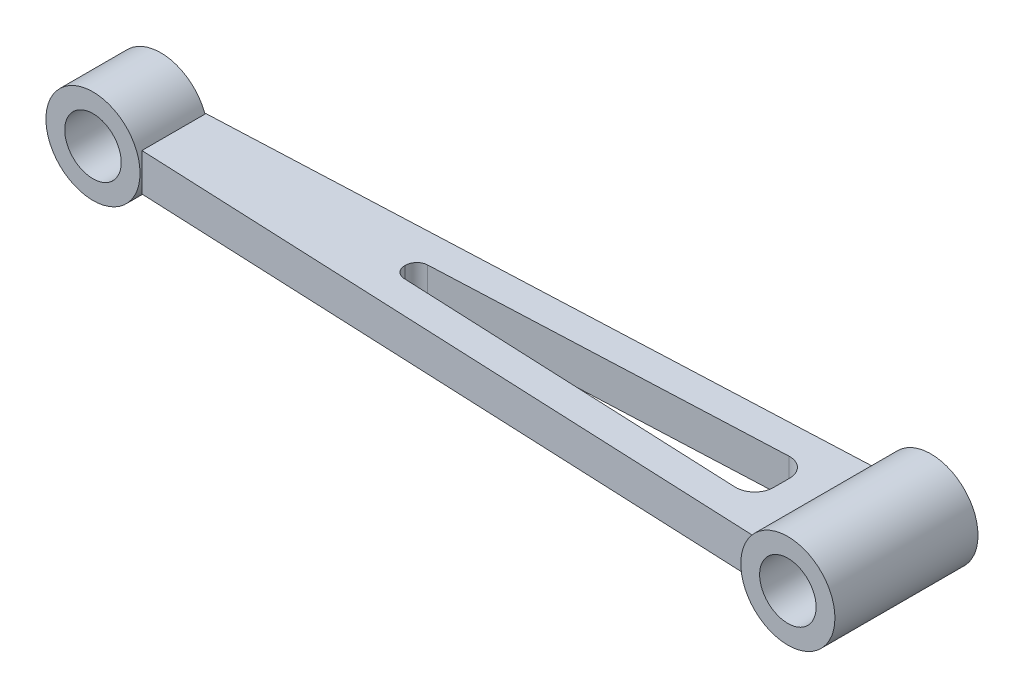
ISO-10303-21;
HEADER;
FILE_DESCRIPTION(('STEP AP214'),'2;1');
FILE_NAME('part.step','',(''),(''),'','','');
FILE_SCHEMA(('AUTOMOTIVE_DESIGN { 1 0 10303 214 1 1 1 1 }'));
ENDSEC;
DATA;
#1=APPLICATION_CONTEXT('core data for automotive mechanical design processes');
#2=APPLICATION_PROTOCOL_DEFINITION('international standard','automotive_design',2000,#1);
#3=PRODUCT_CONTEXT('',#1,'mechanical');
#4=PRODUCT('Part','Part','',(#3));
#5=PRODUCT_RELATED_PRODUCT_CATEGORY('part','',(#4));
#6=PRODUCT_DEFINITION_FORMATION('','',#4);
#7=PRODUCT_DEFINITION_CONTEXT('part definition',#1,'design');
#8=PRODUCT_DEFINITION('design','',#6,#7);
#9=PRODUCT_DEFINITION_SHAPE('','',#8);
#10=(LENGTH_UNIT() NAMED_UNIT(*) SI_UNIT(.MILLI.,.METRE.));
#11=(NAMED_UNIT(*) PLANE_ANGLE_UNIT() SI_UNIT($,.RADIAN.));
#12=(NAMED_UNIT(*) SI_UNIT($,.STERADIAN.) SOLID_ANGLE_UNIT());
#13=UNCERTAINTY_MEASURE_WITH_UNIT(LENGTH_MEASURE(1.E-05),#10,'distance_accuracy_value','');
#14=(GEOMETRIC_REPRESENTATION_CONTEXT(3) GLOBAL_UNCERTAINTY_ASSIGNED_CONTEXT((#13)) GLOBAL_UNIT_ASSIGNED_CONTEXT((#10,
#11,#12)) REPRESENTATION_CONTEXT('',''));
#15=CARTESIAN_POINT('',(0.,0.,0.));
#16=DIRECTION('',(0.,0.,1.));
#17=DIRECTION('',(1.,0.,0.));
#18=AXIS2_PLACEMENT_3D('',#15,#16,#17);
#19=CARTESIAN_POINT('',(182.06,-5.,19.));
#20=DIRECTION('',(0.,0.,1.));
#21=DIRECTION('',(1.,0.,0.));
#22=AXIS2_PLACEMENT_3D('',#19,#20,#21);
#23=PLANE('',#22);
#24=CARTESIAN_POINT('',(182.06,-5.,19.));
#25=DIRECTION('',(0.,0.,1.));
#26=DIRECTION('',(1.,0.,0.));
#27=AXIS2_PLACEMENT_3D('',#24,#25,#26);
#28=CIRCLE('',#27,12.5);
#29=CARTESIAN_POINT('',(194.56,-5.,19.));
#30=VERTEX_POINT('',#29);
#31=EDGE_CURVE('E11',#30,#30,#28,.T.);
#32=ORIENTED_EDGE('',*,*,#31,.T.);
#33=EDGE_LOOP('',(#32));
#34=FACE_BOUND('',#33,.T.);
#35=CARTESIAN_POINT('',(182.06,-5.,19.));
#36=DIRECTION('',(0.,0.,1.));
#37=DIRECTION('',(1.,0.,0.));
#38=AXIS2_PLACEMENT_3D('',#35,#36,#37);
#39=CIRCLE('',#38,7.50000000000001);
#40=CARTESIAN_POINT('',(189.56,-5.,19.));
#41=VERTEX_POINT('',#40);
#42=EDGE_CURVE('E65',#41,#41,#39,.T.);
#43=ORIENTED_EDGE('',*,*,#42,.F.);
#44=EDGE_LOOP('',(#43));
#45=FACE_BOUND('',#44,.T.);
#46=ADVANCED_FACE('F54',(#34,#45),#23,.T.);
#47=CARTESIAN_POINT('',(182.06,-5.,-19.));
#48=DIRECTION('',(0.,0.,1.));
#49=DIRECTION('',(1.,0.,0.));
#50=AXIS2_PLACEMENT_3D('',#47,#48,#49);
#51=PLANE('',#50);
#52=CARTESIAN_POINT('',(182.06,-5.,-19.));
#53=DIRECTION('',(0.,0.,1.));
#54=DIRECTION('',(1.,0.,0.));
#55=AXIS2_PLACEMENT_3D('',#52,#53,#54);
#56=CIRCLE('',#55,12.5);
#57=CARTESIAN_POINT('',(194.56,-5.,-19.));
#58=VERTEX_POINT('',#57);
#59=EDGE_CURVE('E58',#58,#58,#56,.T.);
#60=ORIENTED_EDGE('',*,*,#59,.F.);
#61=EDGE_LOOP('',(#60));
#62=FACE_BOUND('',#61,.T.);
#63=CARTESIAN_POINT('',(182.06,-5.,-19.));
#64=DIRECTION('',(0.,0.,1.));
#65=DIRECTION('',(1.,0.,0.));
#66=AXIS2_PLACEMENT_3D('',#63,#64,#65);
#67=CIRCLE('',#66,7.50000000000001);
#68=CARTESIAN_POINT('',(189.56,-5.,-19.));
#69=VERTEX_POINT('',#68);
#70=EDGE_CURVE('E67',#69,#69,#67,.T.);
#71=ORIENTED_EDGE('',*,*,#70,.T.);
#72=EDGE_LOOP('',(#71));
#73=FACE_BOUND('',#72,.T.);
#74=ADVANCED_FACE('F77',(#62,#73),#51,.F.);
#75=CARTESIAN_POINT('',(182.06,-5.,19.));
#76=DIRECTION('',(0.,0.,-1.));
#77=DIRECTION('',(-1.,0.,0.));
#78=AXIS2_PLACEMENT_3D('',#75,#76,#77);
#79=CYLINDRICAL_SURFACE('',#78,12.5);
#80=ORIENTED_EDGE('',*,*,#31,.F.);
#81=EDGE_LOOP('',(#80));
#82=FACE_BOUND('',#81,.T.);
#83=ORIENTED_EDGE('',*,*,#59,.T.);
#84=EDGE_LOOP('',(#83));
#85=FACE_BOUND('',#84,.T.);
#86=ADVANCED_FACE('F56',(#82,#85),#79,.T.);
#87=CARTESIAN_POINT('',(182.06,-5.,19.));
#88=DIRECTION('',(0.,0.,-1.));
#89=DIRECTION('',(-1.,0.,0.));
#90=AXIS2_PLACEMENT_3D('',#87,#88,#89);
#91=CYLINDRICAL_SURFACE('',#90,7.50000000000001);
#92=ORIENTED_EDGE('',*,*,#42,.T.);
#93=EDGE_LOOP('',(#92));
#94=FACE_BOUND('',#93,.T.);
#95=ORIENTED_EDGE('',*,*,#70,.F.);
#96=EDGE_LOOP('',(#95));
#97=FACE_BOUND('',#96,.T.);
#98=ADVANCED_FACE('F73',(#94,#97),#91,.F.);
#99=CLOSED_SHELL('',(#46,#74,#86,#98));
#100=MANIFOLD_SOLID_BREP('B2',#99);
#101=CARTESIAN_POINT('',(-12.5,-5.,9.));
#102=DIRECTION('',(0.,0.,1.));
#103=DIRECTION('',(1.,0.,0.));
#104=AXIS2_PLACEMENT_3D('',#101,#102,#103);
#105=PLANE('',#104);
#106=CARTESIAN_POINT('',(-12.5,-5.,9.));
#107=DIRECTION('',(0.,0.,1.));
#108=DIRECTION('',(1.,0.,0.));
#109=AXIS2_PLACEMENT_3D('',#106,#107,#108);
#110=CIRCLE('',#109,12.5);
#111=CARTESIAN_POINT('',(0.,-5.,9.));
#112=VERTEX_POINT('',#111);
#113=EDGE_CURVE('E53',#112,#112,#110,.T.);
#114=ORIENTED_EDGE('',*,*,#113,.T.);
#115=EDGE_LOOP('',(#114));
#116=FACE_BOUND('',#115,.T.);
#117=CARTESIAN_POINT('',(-12.5,-5.,9.));
#118=DIRECTION('',(0.,0.,1.));
#119=DIRECTION('',(1.,0.,0.));
#120=AXIS2_PLACEMENT_3D('',#117,#118,#119);
#121=CIRCLE('',#120,7.5);
#122=CARTESIAN_POINT('',(-5.,-5.,9.));
#123=VERTEX_POINT('',#122);
#124=EDGE_CURVE('E136',#123,#123,#121,.T.);
#125=ORIENTED_EDGE('',*,*,#124,.F.);
#126=EDGE_LOOP('',(#125));
#127=FACE_BOUND('',#126,.T.);
#128=ADVANCED_FACE('F125',(#116,#127),#105,.T.);
#129=CARTESIAN_POINT('',(-12.5,-5.,-9.));
#130=DIRECTION('',(0.,0.,1.));
#131=DIRECTION('',(1.,0.,0.));
#132=AXIS2_PLACEMENT_3D('',#129,#130,#131);
#133=PLANE('',#132);
#134=CARTESIAN_POINT('',(-12.5,-5.,-9.));
#135=DIRECTION('',(0.,0.,1.));
#136=DIRECTION('',(1.,0.,0.));
#137=AXIS2_PLACEMENT_3D('',#134,#135,#136);
#138=CIRCLE('',#137,12.5);
#139=CARTESIAN_POINT('',(0.,-5.,-9.));
#140=VERTEX_POINT('',#139);
#141=EDGE_CURVE('E129',#140,#140,#138,.T.);
#142=ORIENTED_EDGE('',*,*,#141,.F.);
#143=EDGE_LOOP('',(#142));
#144=FACE_BOUND('',#143,.T.);
#145=CARTESIAN_POINT('',(-12.5,-5.,-9.));
#146=DIRECTION('',(0.,0.,1.));
#147=DIRECTION('',(1.,0.,0.));
#148=AXIS2_PLACEMENT_3D('',#145,#146,#147);
#149=CIRCLE('',#148,7.5);
#150=CARTESIAN_POINT('',(-5.,-5.,-9.));
#151=VERTEX_POINT('',#150);
#152=EDGE_CURVE('E138',#151,#151,#149,.T.);
#153=ORIENTED_EDGE('',*,*,#152,.T.);
#154=EDGE_LOOP('',(#153));
#155=FACE_BOUND('',#154,.T.);
#156=ADVANCED_FACE('F148',(#144,#155),#133,.F.);
#157=CARTESIAN_POINT('',(-12.5,-5.,9.));
#158=DIRECTION('',(0.,0.,-1.));
#159=DIRECTION('',(-1.,0.,0.));
#160=AXIS2_PLACEMENT_3D('',#157,#158,#159);
#161=CYLINDRICAL_SURFACE('',#160,12.5);
#162=ORIENTED_EDGE('',*,*,#113,.F.);
#163=EDGE_LOOP('',(#162));
#164=FACE_BOUND('',#163,.T.);
#165=ORIENTED_EDGE('',*,*,#141,.T.);
#166=EDGE_LOOP('',(#165));
#167=FACE_BOUND('',#166,.T.);
#168=ADVANCED_FACE('F127',(#164,#167),#161,.T.);
#169=CARTESIAN_POINT('',(-12.5,-5.,9.));
#170=DIRECTION('',(0.,0.,-1.));
#171=DIRECTION('',(-1.,0.,0.));
#172=AXIS2_PLACEMENT_3D('',#169,#170,#171);
#173=CYLINDRICAL_SURFACE('',#172,7.5);
#174=ORIENTED_EDGE('',*,*,#124,.T.);
#175=EDGE_LOOP('',(#174));
#176=FACE_BOUND('',#175,.T.);
#177=ORIENTED_EDGE('',*,*,#152,.F.);
#178=EDGE_LOOP('',(#177));
#179=FACE_BOUND('',#178,.T.);
#180=ADVANCED_FACE('F144',(#176,#179),#173,.F.);
#181=CLOSED_SHELL('',(#128,#156,#168,#180));
#182=MANIFOLD_SOLID_BREP('B6',#181);
#183=CARTESIAN_POINT('',(61.39,-10.,0.));
#184=DIRECTION('',(1.,0.,0.));
#185=DIRECTION('',(0.,0.,-1.));
#186=AXIS2_PLACEMENT_3D('',#183,#184,#185);
#187=PLANE('',#186);
#188=DIRECTION('',(0.,0.,-1.));
#189=VECTOR('',#188,1.);
#190=CARTESIAN_POINT('',(61.39,0.,0.));
#191=LINE('',#190,#189);
#192=CARTESIAN_POINT('',(61.39,0.,0.128124773235546));
#193=VERTEX_POINT('',#192);
#194=CARTESIAN_POINT('',(61.39,0.,-0.128124773235546));
#195=VERTEX_POINT('',#194);
#196=EDGE_CURVE('E331',#193,#195,#191,.T.);
#197=ORIENTED_EDGE('',*,*,#196,.F.);
#198=DIRECTION('',(0.,1.,0.));
#199=VECTOR('',#198,1.);
#200=CARTESIAN_POINT('',(61.39,-10.,0.128124773235546));
#201=LINE('',#200,#199);
#202=CARTESIAN_POINT('',(61.39,-10.,0.128124773235546));
#203=VERTEX_POINT('',#202);
#204=EDGE_CURVE('E123',#203,#193,#201,.T.);
#205=ORIENTED_EDGE('',*,*,#204,.F.);
#206=DIRECTION('',(0.,0.,-1.));
#207=VECTOR('',#206,1.);
#208=CARTESIAN_POINT('',(61.39,-10.,0.));
#209=LINE('',#208,#207);
#210=CARTESIAN_POINT('',(61.39,-10.,-0.128124773235546));
#211=VERTEX_POINT('',#210);
#212=EDGE_CURVE('E432',#203,#211,#209,.T.);
#213=ORIENTED_EDGE('',*,*,#212,.T.);
#214=DIRECTION('',(0.,1.,0.));
#215=VECTOR('',#214,1.);
#216=CARTESIAN_POINT('',(61.39,-10.,-0.128124773235546));
#217=LINE('',#216,#215);
#218=EDGE_CURVE('E374',#211,#195,#217,.T.);
#219=ORIENTED_EDGE('',*,*,#218,.T.);
#220=EDGE_LOOP('',(#197,#205,#213,#219));
#221=FACE_BOUND('',#220,.T.);
#222=ADVANCED_FACE('F187',(#221),#187,.T.);
#223=CARTESIAN_POINT('',(64.39,-10.,0.128124773235567));
#224=DIRECTION('',(0.,1.,0.));
#225=DIRECTION('',(0.,0.,1.));
#226=AXIS2_PLACEMENT_3D('',#223,#224,#225);
#227=CYLINDRICAL_SURFACE('',#226,3.);
#228=CARTESIAN_POINT('',(64.39,0.,0.128124773235567));
#229=DIRECTION('',(0.,1.,0.));
#230=DIRECTION('',(0.,0.,1.));
#231=AXIS2_PLACEMENT_3D('',#228,#229,#230);
#232=CIRCLE('',#231,3.);
#233=CARTESIAN_POINT('',(64.259141837904,0.,3.12526943798114));
#234=VERTEX_POINT('',#233);
#235=EDGE_CURVE('E356',#234,#193,#232,.F.);
#236=ORIENTED_EDGE('',*,*,#235,.F.);
#237=DIRECTION('',(0.,1.,0.));
#238=VECTOR('',#237,1.);
#239=CARTESIAN_POINT('',(64.259141837904,-10.,3.12526943798114));
#240=LINE('',#239,#238);
#241=CARTESIAN_POINT('',(64.259141837904,-10.,3.12526943798114));
#242=VERTEX_POINT('',#241);
#243=EDGE_CURVE('E198',#242,#234,#240,.T.);
#244=ORIENTED_EDGE('',*,*,#243,.F.);
#245=CARTESIAN_POINT('',(64.39,-10.,0.128124773235567));
#246=DIRECTION('',(0.,1.,0.));
#247=DIRECTION('',(0.,0.,1.));
#248=AXIS2_PLACEMENT_3D('',#245,#246,#247);
#249=CIRCLE('',#248,3.);
#250=EDGE_CURVE('E301',#242,#203,#249,.F.);
#251=ORIENTED_EDGE('',*,*,#250,.T.);
#252=ORIENTED_EDGE('',*,*,#204,.T.);
#253=EDGE_LOOP('',(#236,#244,#251,#252));
#254=FACE_BOUND('',#253,.T.);
#255=ADVANCED_FACE('F412',(#254),#227,.F.);
#256=CARTESIAN_POINT('',(-0.0139298720476243,-10.,0.319046523498457));
#257=DIRECTION('',(0.0436193873653326,0.,-0.999048221581858));
#258=DIRECTION('',(-0.999048221581858,0.,-0.0436193873653327));
#259=AXIS2_PLACEMENT_3D('',#256,#257,#258);
#260=PLANE('',#259);
#261=DIRECTION('',(-0.999048221581858,0.,-0.0436193873653326));
#262=VECTOR('',#261,1.);
#263=CARTESIAN_POINT('',(-0.0139298720476243,0.,0.319046523498457));
#264=LINE('',#263,#262);
#265=CARTESIAN_POINT('',(156.171903063173,0.,7.13826725840102));
#266=VERTEX_POINT('',#265);
#267=EDGE_CURVE('E287',#266,#234,#264,.T.);
#268=ORIENTED_EDGE('',*,*,#267,.F.);
#269=DIRECTION('',(0.,1.,0.));
#270=VECTOR('',#269,1.);
#271=CARTESIAN_POINT('',(156.171903063173,-10.,7.13826725840102));
#272=LINE('',#271,#270);
#273=CARTESIAN_POINT('',(156.171903063173,-10.,7.13826725840102));
#274=VERTEX_POINT('',#273);
#275=EDGE_CURVE('E282',#274,#266,#272,.T.);
#276=ORIENTED_EDGE('',*,*,#275,.F.);
#277=DIRECTION('',(-0.999048221581858,0.,-0.0436193873653326));
#278=VECTOR('',#277,1.);
#279=CARTESIAN_POINT('',(-0.0139298720476243,-10.,0.319046523498457));
#280=LINE('',#279,#278);
#281=EDGE_CURVE('E285',#274,#242,#280,.T.);
#282=ORIENTED_EDGE('',*,*,#281,.T.);
#283=ORIENTED_EDGE('',*,*,#243,.T.);
#284=EDGE_LOOP('',(#268,#276,#282,#283));
#285=FACE_BOUND('',#284,.T.);
#286=ADVANCED_FACE('F284',(#285),#260,.T.);
#287=CARTESIAN_POINT('',(156.39,-10.,2.14302615049173));
#288=DIRECTION('',(0.,1.,0.));
#289=DIRECTION('',(0.,0.,1.));
#290=AXIS2_PLACEMENT_3D('',#287,#288,#289);
#291=CYLINDRICAL_SURFACE('',#290,4.99999999999999);
#292=CARTESIAN_POINT('',(156.39,0.,2.14302615049173));
#293=DIRECTION('',(0.,1.,0.));
#294=DIRECTION('',(0.,0.,1.));
#295=AXIS2_PLACEMENT_3D('',#292,#293,#294);
#296=CIRCLE('',#295,4.99999999999999);
#297=CARTESIAN_POINT('',(161.39,0.,2.14302615049172));
#298=VERTEX_POINT('',#297);
#299=EDGE_CURVE('E351',#298,#266,#296,.F.);
#300=ORIENTED_EDGE('',*,*,#299,.F.);
#301=DIRECTION('',(0.,1.,0.));
#302=VECTOR('',#301,1.);
#303=CARTESIAN_POINT('',(161.39,-10.,2.14302615049172));
#304=LINE('',#303,#302);
#305=CARTESIAN_POINT('',(161.39,-10.,2.14302615049172));
#306=VERTEX_POINT('',#305);
#307=EDGE_CURVE('E293',#306,#298,#304,.T.);
#308=ORIENTED_EDGE('',*,*,#307,.F.);
#309=CARTESIAN_POINT('',(156.39,-10.,2.14302615049173));
#310=DIRECTION('',(0.,1.,0.));
#311=DIRECTION('',(0.,0.,1.));
#312=AXIS2_PLACEMENT_3D('',#309,#310,#311);
#313=CIRCLE('',#312,4.99999999999999);
#314=EDGE_CURVE('E299',#306,#274,#313,.F.);
#315=ORIENTED_EDGE('',*,*,#314,.T.);
#316=ORIENTED_EDGE('',*,*,#275,.T.);
#317=EDGE_LOOP('',(#300,#308,#315,#316));
#318=FACE_BOUND('',#317,.T.);
#319=ADVANCED_FACE('F304',(#318),#291,.F.);
#320=CARTESIAN_POINT('',(161.39,-10.,0.));
#321=DIRECTION('',(-1.,0.,0.));
#322=DIRECTION('',(0.,0.,1.));
#323=AXIS2_PLACEMENT_3D('',#320,#321,#322);
#324=PLANE('',#323);
#325=DIRECTION('',(0.,0.,1.));
#326=VECTOR('',#325,1.);
#327=CARTESIAN_POINT('',(161.39,0.,0.));
#328=LINE('',#327,#326);
#329=CARTESIAN_POINT('',(161.39,0.,-2.14302615049173));
#330=VERTEX_POINT('',#329);
#331=EDGE_CURVE('E347',#330,#298,#328,.T.);
#332=ORIENTED_EDGE('',*,*,#331,.F.);
#333=DIRECTION('',(0.,1.,0.));
#334=VECTOR('',#333,1.);
#335=CARTESIAN_POINT('',(161.39,-10.,-2.14302615049173));
#336=LINE('',#335,#334);
#337=CARTESIAN_POINT('',(161.39,-10.,-2.14302615049173));
#338=VERTEX_POINT('',#337);
#339=EDGE_CURVE('E365',#338,#330,#336,.T.);
#340=ORIENTED_EDGE('',*,*,#339,.F.);
#341=DIRECTION('',(0.,0.,1.));
#342=VECTOR('',#341,1.);
#343=CARTESIAN_POINT('',(161.39,-10.,0.));
#344=LINE('',#343,#342);
#345=EDGE_CURVE('E306',#338,#306,#344,.T.);
#346=ORIENTED_EDGE('',*,*,#345,.T.);
#347=ORIENTED_EDGE('',*,*,#307,.T.);
#348=EDGE_LOOP('',(#332,#340,#346,#347));
#349=FACE_BOUND('',#348,.T.);
#350=ADVANCED_FACE('F465',(#349),#324,.T.);
#351=CARTESIAN_POINT('',(156.39,-10.,-2.14302615049173));
#352=DIRECTION('',(0.,1.,0.));
#353=DIRECTION('',(0.,0.,1.));
#354=AXIS2_PLACEMENT_3D('',#351,#352,#353);
#355=CYLINDRICAL_SURFACE('',#354,4.99999999999999);
#356=CARTESIAN_POINT('',(156.39,0.,-2.14302615049173));
#357=DIRECTION('',(0.,1.,0.));
#358=DIRECTION('',(0.,0.,1.));
#359=AXIS2_PLACEMENT_3D('',#356,#357,#358);
#360=CIRCLE('',#359,4.99999999999999);
#361=CARTESIAN_POINT('',(156.171903063173,0.,-7.13826725840102));
#362=VERTEX_POINT('',#361);
#363=EDGE_CURVE('E343',#330,#362,#360,.T.);
#364=ORIENTED_EDGE('',*,*,#363,.T.);
#365=DIRECTION('',(0.,1.,0.));
#366=VECTOR('',#365,1.);
#367=CARTESIAN_POINT('',(156.171903063173,-10.,-7.13826725840102));
#368=LINE('',#367,#366);
#369=CARTESIAN_POINT('',(156.171903063173,-10.,-7.13826725840102));
#370=VERTEX_POINT('',#369);
#371=EDGE_CURVE('E368',#370,#362,#368,.T.);
#372=ORIENTED_EDGE('',*,*,#371,.F.);
#373=CARTESIAN_POINT('',(156.39,-10.,-2.14302615049173));
#374=DIRECTION('',(0.,1.,0.));
#375=DIRECTION('',(0.,0.,1.));
#376=AXIS2_PLACEMENT_3D('',#373,#374,#375);
#377=CIRCLE('',#376,4.99999999999999);
#378=EDGE_CURVE('E309',#338,#370,#377,.T.);
#379=ORIENTED_EDGE('',*,*,#378,.F.);
#380=ORIENTED_EDGE('',*,*,#339,.T.);
#381=EDGE_LOOP('',(#364,#372,#379,#380));
#382=FACE_BOUND('',#381,.T.);
#383=ADVANCED_FACE('F458',(#382),#355,.F.);
#384=CARTESIAN_POINT('',(-0.0139298720476243,-10.,-0.319046523498456));
#385=DIRECTION('',(0.0436193873653327,0.,0.999048221581858));
#386=DIRECTION('',(0.999048221581858,0.,-0.0436193873653327));
#387=AXIS2_PLACEMENT_3D('',#384,#385,#386);
#388=PLANE('',#387);
#389=DIRECTION('',(0.999048221581858,0.,-0.0436193873653327));
#390=VECTOR('',#389,1.);
#391=CARTESIAN_POINT('',(-0.0139298720476243,0.,-0.319046523498456));
#392=LINE('',#391,#390);
#393=CARTESIAN_POINT('',(64.259141837904,0.,-3.12526943798114));
#394=VERTEX_POINT('',#393);
#395=EDGE_CURVE('E339',#394,#362,#392,.T.);
#396=ORIENTED_EDGE('',*,*,#395,.F.);
#397=DIRECTION('',(0.,1.,0.));
#398=VECTOR('',#397,1.);
#399=CARTESIAN_POINT('',(64.259141837904,-10.,-3.12526943798114));
#400=LINE('',#399,#398);
#401=CARTESIAN_POINT('',(64.259141837904,-10.,-3.12526943798114));
#402=VERTEX_POINT('',#401);
#403=EDGE_CURVE('E371',#402,#394,#400,.T.);
#404=ORIENTED_EDGE('',*,*,#403,.F.);
#405=DIRECTION('',(0.999048221581858,0.,-0.0436193873653327));
#406=VECTOR('',#405,1.);
#407=CARTESIAN_POINT('',(-0.0139298720476243,-10.,-0.319046523498456));
#408=LINE('',#407,#406);
#409=EDGE_CURVE('E449',#402,#370,#408,.T.);
#410=ORIENTED_EDGE('',*,*,#409,.T.);
#411=ORIENTED_EDGE('',*,*,#371,.T.);
#412=EDGE_LOOP('',(#396,#404,#410,#411));
#413=FACE_BOUND('',#412,.T.);
#414=ADVANCED_FACE('F426',(#413),#388,.T.);
#415=CARTESIAN_POINT('',(-0.370411906677519,-10.,-8.48382746688992));
#416=DIRECTION('',(0.0436193873653326,0.,0.999048221581858));
#417=DIRECTION('',(0.999048221581858,0.,-0.0436193873653327));
#418=AXIS2_PLACEMENT_3D('',#415,#416,#417);
#419=PLANE('',#418);
#420=DIRECTION('',(0.999048221581858,0.,-0.0436193873653326));
#421=VECTOR('',#420,1.);
#422=CARTESIAN_POINT('',(-0.370411906677519,0.,-8.48382746688992));
#423=LINE('',#422,#421);
#424=CARTESIAN_POINT('',(0.,0.,-8.5));
#425=VERTEX_POINT('',#424);
#426=CARTESIAN_POINT('',(169.56,0.,-15.9031494795667));
#427=VERTEX_POINT('',#426);
#428=EDGE_CURVE('E315',#425,#427,#423,.T.);
#429=ORIENTED_EDGE('',*,*,#428,.T.);
#430=DIRECTION('',(0.,1.,0.));
#431=VECTOR('',#430,1.);
#432=CARTESIAN_POINT('',(169.56,-10.,-15.9031494795667));
#433=LINE('',#432,#431);
#434=CARTESIAN_POINT('',(169.56,-10.,-15.9031494795667));
#435=VERTEX_POINT('',#434);
#436=EDGE_CURVE('E377',#435,#427,#433,.T.);
#437=ORIENTED_EDGE('',*,*,#436,.F.);
#438=DIRECTION('',(0.999048221581858,0.,-0.0436193873653326));
#439=VECTOR('',#438,1.);
#440=CARTESIAN_POINT('',(-0.370411906677519,-10.,-8.48382746688992));
#441=LINE('',#440,#439);
#442=CARTESIAN_POINT('',(0.,-10.,-8.5));
#443=VERTEX_POINT('',#442);
#444=EDGE_CURVE('E359',#443,#435,#441,.T.);
#445=ORIENTED_EDGE('',*,*,#444,.F.);
#446=DIRECTION('',(0.,1.,0.));
#447=VECTOR('',#446,1.);
#448=CARTESIAN_POINT('',(0.,-10.,-8.5));
#449=LINE('',#448,#447);
#450=EDGE_CURVE('E191',#443,#425,#449,.T.);
#451=ORIENTED_EDGE('',*,*,#450,.T.);
#452=EDGE_LOOP('',(#429,#437,#445,#451));
#453=FACE_BOUND('',#452,.T.);
#454=ADVANCED_FACE('F189',(#453),#419,.F.);
#455=CARTESIAN_POINT('',(169.56,-10.,0.));
#456=DIRECTION('',(-1.,0.,0.));
#457=DIRECTION('',(0.,0.,1.));
#458=AXIS2_PLACEMENT_3D('',#455,#456,#457);
#459=PLANE('',#458);
#460=ORIENTED_EDGE('',*,*,#436,.T.);
#461=DIRECTION('',(0.,0.,1.));
#462=VECTOR('',#461,1.);
#463=CARTESIAN_POINT('',(169.56,0.,0.));
#464=LINE('',#463,#462);
#465=CARTESIAN_POINT('',(169.56,0.,15.9031494795667));
#466=VERTEX_POINT('',#465);
#467=EDGE_CURVE('E327',#427,#466,#464,.T.);
#468=ORIENTED_EDGE('',*,*,#467,.T.);
#469=DIRECTION('',(0.,1.,0.));
#470=VECTOR('',#469,1.);
#471=CARTESIAN_POINT('',(169.56,-10.,15.9031494795667));
#472=LINE('',#471,#470);
#473=CARTESIAN_POINT('',(169.56,-10.,15.9031494795667));
#474=VERTEX_POINT('',#473);
#475=EDGE_CURVE('E380',#474,#466,#472,.T.);
#476=ORIENTED_EDGE('',*,*,#475,.F.);
#477=DIRECTION('',(0.,0.,1.));
#478=VECTOR('',#477,1.);
#479=CARTESIAN_POINT('',(169.56,-10.,0.));
#480=LINE('',#479,#478);
#481=EDGE_CURVE('E428',#435,#474,#480,.T.);
#482=ORIENTED_EDGE('',*,*,#481,.F.);
#483=EDGE_LOOP('',(#460,#468,#476,#482));
#484=FACE_BOUND('',#483,.T.);
#485=ADVANCED_FACE('F408',(#484),#459,.F.);
#486=CARTESIAN_POINT('',(-0.370411906677519,-10.,8.48382746688992));
#487=DIRECTION('',(0.0436193873653326,0.,-0.999048221581858));
#488=DIRECTION('',(-0.999048221581858,0.,-0.0436193873653327));
#489=AXIS2_PLACEMENT_3D('',#486,#487,#488);
#490=PLANE('',#489);
#491=DIRECTION('',(-0.999048221581858,0.,-0.0436193873653326));
#492=VECTOR('',#491,1.);
#493=CARTESIAN_POINT('',(-0.370411906677519,0.,8.48382746688992));
#494=LINE('',#493,#492);
#495=CARTESIAN_POINT('',(0.,0.,8.5));
#496=VERTEX_POINT('',#495);
#497=EDGE_CURVE('E323',#466,#496,#494,.T.);
#498=ORIENTED_EDGE('',*,*,#497,.T.);
#499=DIRECTION('',(0.,1.,0.));
#500=VECTOR('',#499,1.);
#501=CARTESIAN_POINT('',(0.,-10.,8.5));
#502=LINE('',#501,#500);
#503=CARTESIAN_POINT('',(0.,-10.,8.5));
#504=VERTEX_POINT('',#503);
#505=EDGE_CURVE('E382',#504,#496,#502,.T.);
#506=ORIENTED_EDGE('',*,*,#505,.F.);
#507=DIRECTION('',(-0.999048221581858,0.,-0.0436193873653326));
#508=VECTOR('',#507,1.);
#509=CARTESIAN_POINT('',(-0.370411906677519,-10.,8.48382746688992));
#510=LINE('',#509,#508);
#511=EDGE_CURVE('E433',#474,#504,#510,.T.);
#512=ORIENTED_EDGE('',*,*,#511,.F.);
#513=ORIENTED_EDGE('',*,*,#475,.T.);
#514=EDGE_LOOP('',(#498,#506,#512,#513));
#515=FACE_BOUND('',#514,.T.);
#516=ADVANCED_FACE('F399',(#515),#490,.F.);
#517=CARTESIAN_POINT('',(0.,-10.,0.));
#518=DIRECTION('',(-1.,0.,0.));
#519=DIRECTION('',(0.,0.,1.));
#520=AXIS2_PLACEMENT_3D('',#517,#518,#519);
#521=PLANE('',#520);
#522=ORIENTED_EDGE('',*,*,#505,.T.);
#523=DIRECTION('',(0.,0.,1.));
#524=VECTOR('',#523,1.);
#525=CARTESIAN_POINT('',(0.,0.,0.));
#526=LINE('',#525,#524);
#527=EDGE_CURVE('E319',#425,#496,#526,.T.);
#528=ORIENTED_EDGE('',*,*,#527,.F.);
#529=ORIENTED_EDGE('',*,*,#450,.F.);
#530=DIRECTION('',(0.,0.,1.));
#531=VECTOR('',#530,1.);
#532=CARTESIAN_POINT('',(0.,-10.,0.));
#533=LINE('',#532,#531);
#534=EDGE_CURVE('E435',#443,#504,#533,.T.);
#535=ORIENTED_EDGE('',*,*,#534,.T.);
#536=EDGE_LOOP('',(#522,#528,#529,#535));
#537=FACE_BOUND('',#536,.T.);
#538=ADVANCED_FACE('F396',(#537),#521,.T.);
#539=CARTESIAN_POINT('',(64.39,-10.,-0.128124773235567));
#540=DIRECTION('',(0.,1.,0.));
#541=DIRECTION('',(0.,0.,1.));
#542=AXIS2_PLACEMENT_3D('',#539,#540,#541);
#543=CYLINDRICAL_SURFACE('',#542,3.);
#544=CARTESIAN_POINT('',(64.39,0.,-0.128124773235567));
#545=DIRECTION('',(0.,1.,0.));
#546=DIRECTION('',(0.,0.,1.));
#547=AXIS2_PLACEMENT_3D('',#544,#545,#546);
#548=CIRCLE('',#547,3.);
#549=EDGE_CURVE('E335',#195,#394,#548,.F.);
#550=ORIENTED_EDGE('',*,*,#549,.F.);
#551=ORIENTED_EDGE('',*,*,#218,.F.);
#552=CARTESIAN_POINT('',(64.39,-10.,-0.128124773235567));
#553=DIRECTION('',(0.,1.,0.));
#554=DIRECTION('',(0.,0.,1.));
#555=AXIS2_PLACEMENT_3D('',#552,#553,#554);
#556=CIRCLE('',#555,3.);
#557=EDGE_CURVE('E445',#211,#402,#556,.F.);
#558=ORIENTED_EDGE('',*,*,#557,.T.);
#559=ORIENTED_EDGE('',*,*,#403,.T.);
#560=EDGE_LOOP('',(#550,#551,#558,#559));
#561=FACE_BOUND('',#560,.T.);
#562=ADVANCED_FACE('F398',(#561),#543,.F.);
#563=CARTESIAN_POINT('',(0.,-10.,0.));
#564=DIRECTION('',(0.,1.,0.));
#565=DIRECTION('',(0.,0.,1.));
#566=AXIS2_PLACEMENT_3D('',#563,#564,#565);
#567=PLANE('',#566);
#568=ORIENTED_EDGE('',*,*,#444,.T.);
#569=ORIENTED_EDGE('',*,*,#481,.T.);
#570=ORIENTED_EDGE('',*,*,#511,.T.);
#571=ORIENTED_EDGE('',*,*,#534,.F.);
#572=EDGE_LOOP('',(#568,#569,#570,#571));
#573=FACE_BOUND('',#572,.T.);
#574=ORIENTED_EDGE('',*,*,#212,.F.);
#575=ORIENTED_EDGE('',*,*,#250,.F.);
#576=ORIENTED_EDGE('',*,*,#281,.F.);
#577=ORIENTED_EDGE('',*,*,#314,.F.);
#578=ORIENTED_EDGE('',*,*,#345,.F.);
#579=ORIENTED_EDGE('',*,*,#378,.T.);
#580=ORIENTED_EDGE('',*,*,#409,.F.);
#581=ORIENTED_EDGE('',*,*,#557,.F.);
#582=EDGE_LOOP('',(#574,#575,#576,#577,#578,#579,#580,#581));
#583=FACE_BOUND('',#582,.T.);
#584=ADVANCED_FACE('F297',(#573,#583),#567,.F.);
#585=CARTESIAN_POINT('',(0.,0.,0.));
#586=DIRECTION('',(0.,1.,0.));
#587=DIRECTION('',(0.,0.,1.));
#588=AXIS2_PLACEMENT_3D('',#585,#586,#587);
#589=PLANE('',#588);
#590=ORIENTED_EDGE('',*,*,#428,.F.);
#591=ORIENTED_EDGE('',*,*,#527,.T.);
#592=ORIENTED_EDGE('',*,*,#497,.F.);
#593=ORIENTED_EDGE('',*,*,#467,.F.);
#594=EDGE_LOOP('',(#590,#591,#592,#593));
#595=FACE_BOUND('',#594,.T.);
#596=ORIENTED_EDGE('',*,*,#196,.T.);
#597=ORIENTED_EDGE('',*,*,#549,.T.);
#598=ORIENTED_EDGE('',*,*,#395,.T.);
#599=ORIENTED_EDGE('',*,*,#363,.F.);
#600=ORIENTED_EDGE('',*,*,#331,.T.);
#601=ORIENTED_EDGE('',*,*,#299,.T.);
#602=ORIENTED_EDGE('',*,*,#267,.T.);
#603=ORIENTED_EDGE('',*,*,#235,.T.);
#604=EDGE_LOOP('',(#596,#597,#598,#599,#600,#601,#602,#603));
#605=FACE_BOUND('',#604,.T.);
#606=ADVANCED_FACE('F393',(#595,#605),#589,.T.);
#607=CLOSED_SHELL('',(#222,#255,#286,#319,#350,#383,#414,#454,#485,#516,#538,#562,#584,#606));
#608=MANIFOLD_SOLID_BREP('B48',#607);
#609=ADVANCED_BREP_SHAPE_REPRESENTATION('',(#18,#100,#182,#608),#14);
#610=SHAPE_DEFINITION_REPRESENTATION(#9,#609);
ENDSEC;
END-ISO-10303-21;
